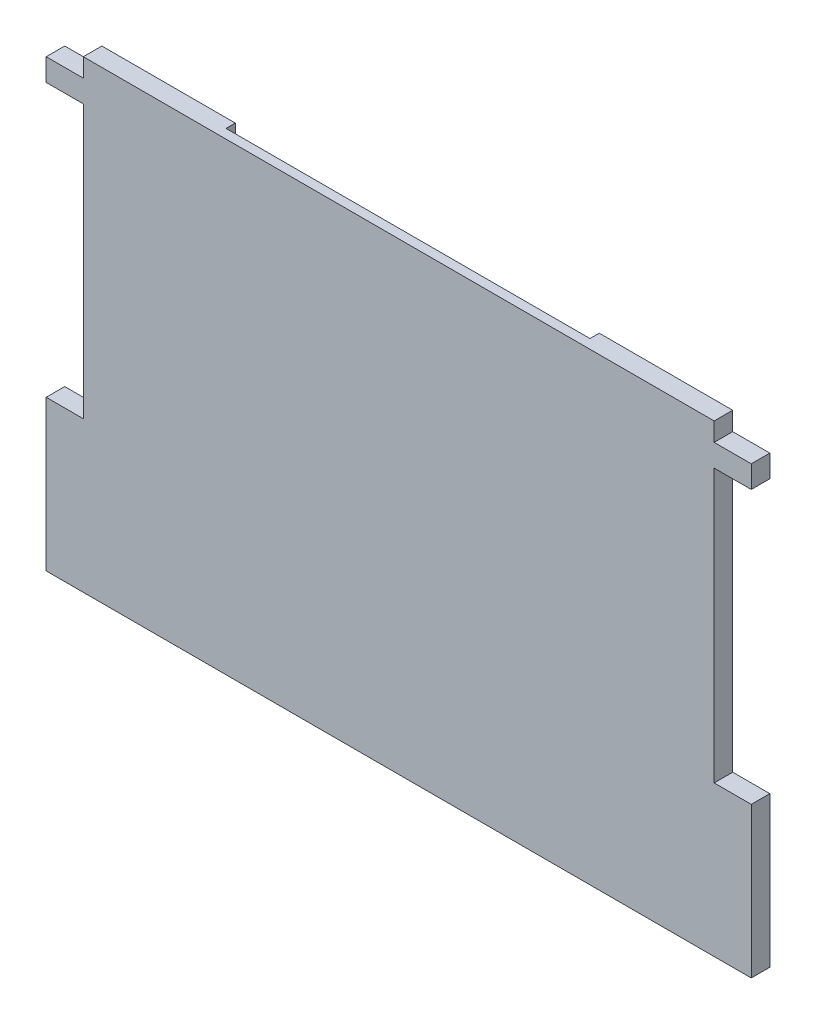
ISO-10303-21;
HEADER;
FILE_DESCRIPTION(('STEP AP214'),'2;1');
FILE_NAME('part.step','',(''),(''),'','','');
FILE_SCHEMA(('AUTOMOTIVE_DESIGN { 1 0 10303 214 1 1 1 1 }'));
ENDSEC;
DATA;
#1=APPLICATION_CONTEXT('core data for automotive mechanical design processes');
#2=APPLICATION_PROTOCOL_DEFINITION('international standard','automotive_design',2000,#1);
#3=PRODUCT_CONTEXT('',#1,'mechanical');
#4=PRODUCT('Part','Part','',(#3));
#5=PRODUCT_RELATED_PRODUCT_CATEGORY('part','',(#4));
#6=PRODUCT_DEFINITION_FORMATION('','',#4);
#7=PRODUCT_DEFINITION_CONTEXT('part definition',#1,'design');
#8=PRODUCT_DEFINITION('design','',#6,#7);
#9=PRODUCT_DEFINITION_SHAPE('','',#8);
#10=(LENGTH_UNIT() NAMED_UNIT(*) SI_UNIT(.MILLI.,.METRE.));
#11=(NAMED_UNIT(*) PLANE_ANGLE_UNIT() SI_UNIT($,.RADIAN.));
#12=(NAMED_UNIT(*) SI_UNIT($,.STERADIAN.) SOLID_ANGLE_UNIT());
#13=UNCERTAINTY_MEASURE_WITH_UNIT(LENGTH_MEASURE(1.E-05),#10,'distance_accuracy_value','');
#14=(GEOMETRIC_REPRESENTATION_CONTEXT(3) GLOBAL_UNCERTAINTY_ASSIGNED_CONTEXT((#13)) GLOBAL_UNIT_ASSIGNED_CONTEXT((#10,
#11,#12)) REPRESENTATION_CONTEXT('',''));
#15=CARTESIAN_POINT('',(0.,0.,0.));
#16=DIRECTION('',(0.,0.,1.));
#17=DIRECTION('',(1.,0.,0.));
#18=AXIS2_PLACEMENT_3D('',#15,#16,#17);
#19=CARTESIAN_POINT('',(-17.,-0.5,1.));
#20=DIRECTION('',(0.,-1.,0.));
#21=DIRECTION('',(0.,0.,-1.));
#22=AXIS2_PLACEMENT_3D('',#19,#20,#21);
#23=PLANE('',#22);
#24=DIRECTION('',(0.,0.,-1.));
#25=VECTOR('',#24,1.);
#26=CARTESIAN_POINT('',(9.80769230769232,-0.5,1.));
#27=LINE('',#26,#25);
#28=CARTESIAN_POINT('',(9.80769230769232,-0.5,0.5));
#29=VERTEX_POINT('',#28);
#30=CARTESIAN_POINT('',(9.80769230769232,-0.5,0.));
#31=VERTEX_POINT('',#30);
#32=EDGE_CURVE('E11',#29,#31,#27,.T.);
#33=ORIENTED_EDGE('',*,*,#32,.F.);
#34=DIRECTION('',(-1.,0.,0.));
#35=VECTOR('',#34,1.);
#36=CARTESIAN_POINT('',(-17.,-0.5,0.5));
#37=LINE('',#36,#35);
#38=CARTESIAN_POINT('',(-9.8076923076923,-0.5,0.5));
#39=VERTEX_POINT('',#38);
#40=EDGE_CURVE('E185',#29,#39,#37,.T.);
#41=ORIENTED_EDGE('',*,*,#40,.T.);
#42=DIRECTION('',(0.,0.,1.));
#43=VECTOR('',#42,1.);
#44=CARTESIAN_POINT('',(-9.8076923076923,-0.5,1.));
#45=LINE('',#44,#43);
#46=CARTESIAN_POINT('',(-9.8076923076923,-0.5,0.));
#47=VERTEX_POINT('',#46);
#48=EDGE_CURVE('E47',#47,#39,#45,.T.);
#49=ORIENTED_EDGE('',*,*,#48,.F.);
#50=DIRECTION('',(1.,0.,0.));
#51=VECTOR('',#50,1.);
#52=CARTESIAN_POINT('',(-17.,-0.5,0.));
#53=LINE('',#52,#51);
#54=CARTESIAN_POINT('',(-17.,-0.5,0.));
#55=VERTEX_POINT('',#54);
#56=EDGE_CURVE('E133',#47,#55,#53,.F.);
#57=ORIENTED_EDGE('',*,*,#56,.T.);
#58=DIRECTION('',(0.,0.,-1.));
#59=VECTOR('',#58,1.);
#60=CARTESIAN_POINT('',(-17.,-0.5,1.));
#61=LINE('',#60,#59);
#62=CARTESIAN_POINT('',(-17.,-0.5,1.));
#63=VERTEX_POINT('',#62);
#64=EDGE_CURVE('E127',#63,#55,#61,.T.);
#65=ORIENTED_EDGE('',*,*,#64,.F.);
#66=DIRECTION('',(-1.,0.,0.));
#67=VECTOR('',#66,1.);
#68=CARTESIAN_POINT('',(-17.,-0.5,1.));
#69=LINE('',#68,#67);
#70=CARTESIAN_POINT('',(17.,-0.5,1.));
#71=VERTEX_POINT('',#70);
#72=EDGE_CURVE('E170',#71,#63,#69,.T.);
#73=ORIENTED_EDGE('',*,*,#72,.F.);
#74=DIRECTION('',(0.,0.,-1.));
#75=VECTOR('',#74,1.);
#76=CARTESIAN_POINT('',(17.,-0.5,1.));
#77=LINE('',#76,#75);
#78=CARTESIAN_POINT('',(17.,-0.5,0.));
#79=VERTEX_POINT('',#78);
#80=EDGE_CURVE('E184',#71,#79,#77,.T.);
#81=ORIENTED_EDGE('',*,*,#80,.T.);
#82=DIRECTION('',(1.,0.,0.));
#83=VECTOR('',#82,1.);
#84=CARTESIAN_POINT('',(-17.,-0.5,0.));
#85=LINE('',#84,#83);
#86=EDGE_CURVE('E173',#79,#31,#85,.F.);
#87=ORIENTED_EDGE('',*,*,#86,.T.);
#88=EDGE_LOOP('',(#33,#41,#49,#57,#65,#73,#81,#87));
#89=FACE_BOUND('',#88,.T.);
#90=ADVANCED_FACE('F39',(#89),#23,.F.);
#91=CARTESIAN_POINT('',(0.,0.,0.));
#92=DIRECTION('',(0.,0.,-1.));
#93=DIRECTION('',(-1.,0.,0.));
#94=AXIS2_PLACEMENT_3D('',#91,#92,#93);
#95=PLANE('',#94);
#96=ORIENTED_EDGE('',*,*,#56,.F.);
#97=DIRECTION('',(0.,-1.,0.));
#98=VECTOR('',#97,1.);
#99=CARTESIAN_POINT('',(-9.8076923076923,1.53846153846154,0.));
#100=LINE('',#99,#98);
#101=CARTESIAN_POINT('',(-9.8076923076923,-1.92307692307692,0.));
#102=VERTEX_POINT('',#101);
#103=EDGE_CURVE('E174',#47,#102,#100,.T.);
#104=ORIENTED_EDGE('',*,*,#103,.T.);
#105=DIRECTION('',(1.,0.,0.));
#106=VECTOR('',#105,1.);
#107=CARTESIAN_POINT('',(-9.8076923076923,-1.92307692307692,0.));
#108=LINE('',#107,#106);
#109=CARTESIAN_POINT('',(-1.73076923076922,-1.92307692307692,0.));
#110=VERTEX_POINT('',#109);
#111=EDGE_CURVE('E180',#102,#110,#108,.T.);
#112=ORIENTED_EDGE('',*,*,#111,.T.);
#113=DIRECTION('',(0.,-1.,0.));
#114=VECTOR('',#113,1.);
#115=CARTESIAN_POINT('',(-1.73076923076922,-1.92307692307692,0.));
#116=LINE('',#115,#114);
#117=CARTESIAN_POINT('',(-1.73076923076922,-10.,0.));
#118=VERTEX_POINT('',#117);
#119=EDGE_CURVE('E288',#110,#118,#116,.T.);
#120=ORIENTED_EDGE('',*,*,#119,.T.);
#121=DIRECTION('',(1.,0.,0.));
#122=VECTOR('',#121,1.);
#123=CARTESIAN_POINT('',(-1.73076923076922,-10.,0.));
#124=LINE('',#123,#122);
#125=CARTESIAN_POINT('',(1.73076923076924,-10.,0.));
#126=VERTEX_POINT('',#125);
#127=EDGE_CURVE('E59',#118,#126,#124,.T.);
#128=ORIENTED_EDGE('',*,*,#127,.T.);
#129=DIRECTION('',(0.,1.,0.));
#130=VECTOR('',#129,1.);
#131=CARTESIAN_POINT('',(1.73076923076924,-10.,0.));
#132=LINE('',#131,#130);
#133=CARTESIAN_POINT('',(1.73076923076924,-1.92307692307692,0.));
#134=VERTEX_POINT('',#133);
#135=EDGE_CURVE('E300',#126,#134,#132,.T.);
#136=ORIENTED_EDGE('',*,*,#135,.T.);
#137=DIRECTION('',(1.,0.,0.));
#138=VECTOR('',#137,1.);
#139=CARTESIAN_POINT('',(1.73076923076924,-1.92307692307692,0.));
#140=LINE('',#139,#138);
#141=CARTESIAN_POINT('',(9.80769230769232,-1.92307692307692,0.));
#142=VERTEX_POINT('',#141);
#143=EDGE_CURVE('E178',#134,#142,#140,.T.);
#144=ORIENTED_EDGE('',*,*,#143,.T.);
#145=DIRECTION('',(0.,1.,0.));
#146=VECTOR('',#145,1.);
#147=CARTESIAN_POINT('',(9.80769230769232,-1.92307692307692,0.));
#148=LINE('',#147,#146);
#149=EDGE_CURVE('E172',#142,#31,#148,.T.);
#150=ORIENTED_EDGE('',*,*,#149,.T.);
#151=ORIENTED_EDGE('',*,*,#86,.F.);
#152=DIRECTION('',(0.,1.,0.));
#153=VECTOR('',#152,1.);
#154=CARTESIAN_POINT('',(17.,-0.5,0.));
#155=LINE('',#154,#153);
#156=CARTESIAN_POINT('',(17.,-1.5,0.));
#157=VERTEX_POINT('',#156);
#158=EDGE_CURVE('E167',#157,#79,#155,.T.);
#159=ORIENTED_EDGE('',*,*,#158,.F.);
#160=DIRECTION('',(1.,0.,0.));
#161=VECTOR('',#160,1.);
#162=CARTESIAN_POINT('',(17.,-1.5,0.));
#163=LINE('',#162,#161);
#164=CARTESIAN_POINT('',(19.,-1.5,0.));
#165=VERTEX_POINT('',#164);
#166=EDGE_CURVE('E163',#165,#157,#163,.F.);
#167=ORIENTED_EDGE('',*,*,#166,.F.);
#168=DIRECTION('',(0.,1.,0.));
#169=VECTOR('',#168,1.);
#170=CARTESIAN_POINT('',(19.,-1.5,0.));
#171=LINE('',#170,#169);
#172=CARTESIAN_POINT('',(19.,-2.7,0.));
#173=VERTEX_POINT('',#172);
#174=EDGE_CURVE('E165',#173,#165,#171,.T.);
#175=ORIENTED_EDGE('',*,*,#174,.F.);
#176=DIRECTION('',(1.,0.,0.));
#177=VECTOR('',#176,1.);
#178=CARTESIAN_POINT('',(19.,-2.7,0.));
#179=LINE('',#178,#177);
#180=CARTESIAN_POINT('',(17.,-2.7,0.));
#181=VERTEX_POINT('',#180);
#182=EDGE_CURVE('E162',#181,#173,#179,.T.);
#183=ORIENTED_EDGE('',*,*,#182,.F.);
#184=DIRECTION('',(0.,1.,0.));
#185=VECTOR('',#184,1.);
#186=CARTESIAN_POINT('',(17.,-2.7,0.));
#187=LINE('',#186,#185);
#188=CARTESIAN_POINT('',(17.,-17.3947217067352,0.));
#189=VERTEX_POINT('',#188);
#190=EDGE_CURVE('E159',#189,#181,#187,.T.);
#191=ORIENTED_EDGE('',*,*,#190,.F.);
#192=DIRECTION('',(1.,0.,0.));
#193=VECTOR('',#192,1.);
#194=CARTESIAN_POINT('',(17.,-17.3947217067352,0.));
#195=LINE('',#194,#193);
#196=CARTESIAN_POINT('',(19.,-17.3947217067352,0.));
#197=VERTEX_POINT('',#196);
#198=EDGE_CURVE('E160',#197,#189,#195,.F.);
#199=ORIENTED_EDGE('',*,*,#198,.F.);
#200=DIRECTION('',(0.,1.,0.));
#201=VECTOR('',#200,1.);
#202=CARTESIAN_POINT('',(19.,-17.3947217067352,0.));
#203=LINE('',#202,#201);
#204=CARTESIAN_POINT('',(19.,-25.5,0.));
#205=VERTEX_POINT('',#204);
#206=EDGE_CURVE('E153',#205,#197,#203,.T.);
#207=ORIENTED_EDGE('',*,*,#206,.F.);
#208=DIRECTION('',(1.,0.,0.));
#209=VECTOR('',#208,1.);
#210=CARTESIAN_POINT('',(19.,-25.5,0.));
#211=LINE('',#210,#209);
#212=CARTESIAN_POINT('',(-19.,-25.5,0.));
#213=VERTEX_POINT('',#212);
#214=EDGE_CURVE('E155',#213,#205,#211,.T.);
#215=ORIENTED_EDGE('',*,*,#214,.F.);
#216=DIRECTION('',(0.,1.,0.));
#217=VECTOR('',#216,1.);
#218=CARTESIAN_POINT('',(-19.,-25.5,0.));
#219=LINE('',#218,#217);
#220=CARTESIAN_POINT('',(-19.,-17.3947217067352,0.));
#221=VERTEX_POINT('',#220);
#222=EDGE_CURVE('E152',#221,#213,#219,.F.);
#223=ORIENTED_EDGE('',*,*,#222,.F.);
#224=DIRECTION('',(1.,0.,0.));
#225=VECTOR('',#224,1.);
#226=CARTESIAN_POINT('',(-19.,-17.3947217067352,0.));
#227=LINE('',#226,#225);
#228=CARTESIAN_POINT('',(-17.,-17.3947217067352,0.));
#229=VERTEX_POINT('',#228);
#230=EDGE_CURVE('E146',#229,#221,#227,.F.);
#231=ORIENTED_EDGE('',*,*,#230,.F.);
#232=DIRECTION('',(0.,1.,0.));
#233=VECTOR('',#232,1.);
#234=CARTESIAN_POINT('',(-17.,-17.3947217067352,0.));
#235=LINE('',#234,#233);
#236=CARTESIAN_POINT('',(-17.,-2.7,0.));
#237=VERTEX_POINT('',#236);
#238=EDGE_CURVE('E150',#237,#229,#235,.F.);
#239=ORIENTED_EDGE('',*,*,#238,.F.);
#240=DIRECTION('',(1.,0.,0.));
#241=VECTOR('',#240,1.);
#242=CARTESIAN_POINT('',(-17.,-2.7,0.));
#243=LINE('',#242,#241);
#244=CARTESIAN_POINT('',(-19.,-2.7,0.));
#245=VERTEX_POINT('',#244);
#246=EDGE_CURVE('E142',#245,#237,#243,.T.);
#247=ORIENTED_EDGE('',*,*,#246,.F.);
#248=DIRECTION('',(0.,1.,0.));
#249=VECTOR('',#248,1.);
#250=CARTESIAN_POINT('',(-19.,-2.7,0.));
#251=LINE('',#250,#249);
#252=CARTESIAN_POINT('',(-19.,-1.5,0.));
#253=VERTEX_POINT('',#252);
#254=EDGE_CURVE('E145',#253,#245,#251,.F.);
#255=ORIENTED_EDGE('',*,*,#254,.F.);
#256=DIRECTION('',(1.,0.,0.));
#257=VECTOR('',#256,1.);
#258=CARTESIAN_POINT('',(-19.,-1.5,0.));
#259=LINE('',#258,#257);
#260=CARTESIAN_POINT('',(-17.,-1.5,0.));
#261=VERTEX_POINT('',#260);
#262=EDGE_CURVE('E119',#261,#253,#259,.F.);
#263=ORIENTED_EDGE('',*,*,#262,.F.);
#264=DIRECTION('',(0.,1.,0.));
#265=VECTOR('',#264,1.);
#266=CARTESIAN_POINT('',(-17.,-1.5,0.));
#267=LINE('',#266,#265);
#268=EDGE_CURVE('E43',#55,#261,#267,.F.);
#269=ORIENTED_EDGE('',*,*,#268,.F.);
#270=EDGE_LOOP('',(#96,#104,#112,#120,#128,#136,#144,#150,#151,#159,#167,#175,#183,#191,#199,
#207,#215,#223,#231,#239,#247,#255,#263,#269));
#271=FACE_BOUND('',#270,.T.);
#272=ADVANCED_FACE('F139',(#271),#95,.T.);
#273=CARTESIAN_POINT('',(-17.,-1.5,1.));
#274=DIRECTION('',(1.,0.,0.));
#275=DIRECTION('',(0.,0.,-1.));
#276=AXIS2_PLACEMENT_3D('',#273,#274,#275);
#277=PLANE('',#276);
#278=ORIENTED_EDGE('',*,*,#268,.T.);
#279=DIRECTION('',(0.,0.,-1.));
#280=VECTOR('',#279,1.);
#281=CARTESIAN_POINT('',(-17.,-1.5,1.));
#282=LINE('',#281,#280);
#283=CARTESIAN_POINT('',(-17.,-1.5,1.));
#284=VERTEX_POINT('',#283);
#285=EDGE_CURVE('E130',#284,#261,#282,.T.);
#286=ORIENTED_EDGE('',*,*,#285,.F.);
#287=DIRECTION('',(0.,-1.,0.));
#288=VECTOR('',#287,1.);
#289=CARTESIAN_POINT('',(-17.,-1.5,1.));
#290=LINE('',#289,#288);
#291=EDGE_CURVE('E235',#63,#284,#290,.T.);
#292=ORIENTED_EDGE('',*,*,#291,.F.);
#293=ORIENTED_EDGE('',*,*,#64,.T.);
#294=EDGE_LOOP('',(#278,#286,#292,#293));
#295=FACE_BOUND('',#294,.T.);
#296=ADVANCED_FACE('F125',(#295),#277,.F.);
#297=CARTESIAN_POINT('',(-19.,-1.5,1.));
#298=DIRECTION('',(0.,-1.,0.));
#299=DIRECTION('',(1.,0.,0.));
#300=AXIS2_PLACEMENT_3D('',#297,#298,#299);
#301=PLANE('',#300);
#302=ORIENTED_EDGE('',*,*,#262,.T.);
#303=DIRECTION('',(0.,0.,-1.));
#304=VECTOR('',#303,1.);
#305=CARTESIAN_POINT('',(-19.,-1.5,1.));
#306=LINE('',#305,#304);
#307=CARTESIAN_POINT('',(-19.,-1.5,1.));
#308=VERTEX_POINT('',#307);
#309=EDGE_CURVE('E140',#308,#253,#306,.T.);
#310=ORIENTED_EDGE('',*,*,#309,.F.);
#311=DIRECTION('',(-1.,0.,0.));
#312=VECTOR('',#311,1.);
#313=CARTESIAN_POINT('',(-19.,-1.5,1.));
#314=LINE('',#313,#312);
#315=EDGE_CURVE('E136',#284,#308,#314,.T.);
#316=ORIENTED_EDGE('',*,*,#315,.F.);
#317=ORIENTED_EDGE('',*,*,#285,.T.);
#318=EDGE_LOOP('',(#302,#310,#316,#317));
#319=FACE_BOUND('',#318,.T.);
#320=ADVANCED_FACE('F132',(#319),#301,.F.);
#321=CARTESIAN_POINT('',(-19.,-2.7,1.));
#322=DIRECTION('',(1.,0.,0.));
#323=DIRECTION('',(0.,0.,-1.));
#324=AXIS2_PLACEMENT_3D('',#321,#322,#323);
#325=PLANE('',#324);
#326=ORIENTED_EDGE('',*,*,#254,.T.);
#327=DIRECTION('',(0.,0.,-1.));
#328=VECTOR('',#327,1.);
#329=CARTESIAN_POINT('',(-19.,-2.7,1.));
#330=LINE('',#329,#328);
#331=CARTESIAN_POINT('',(-19.,-2.7,1.));
#332=VERTEX_POINT('',#331);
#333=EDGE_CURVE('E225',#332,#245,#330,.T.);
#334=ORIENTED_EDGE('',*,*,#333,.F.);
#335=DIRECTION('',(0.,-1.,0.));
#336=VECTOR('',#335,1.);
#337=CARTESIAN_POINT('',(-19.,-2.7,1.));
#338=LINE('',#337,#336);
#339=EDGE_CURVE('E237',#308,#332,#338,.T.);
#340=ORIENTED_EDGE('',*,*,#339,.F.);
#341=ORIENTED_EDGE('',*,*,#309,.T.);
#342=EDGE_LOOP('',(#326,#334,#340,#341));
#343=FACE_BOUND('',#342,.T.);
#344=ADVANCED_FACE('F471',(#343),#325,.F.);
#345=CARTESIAN_POINT('',(-17.,-2.7,1.));
#346=DIRECTION('',(0.,1.,0.));
#347=DIRECTION('',(0.,0.,1.));
#348=AXIS2_PLACEMENT_3D('',#345,#346,#347);
#349=PLANE('',#348);
#350=ORIENTED_EDGE('',*,*,#246,.T.);
#351=DIRECTION('',(0.,0.,-1.));
#352=VECTOR('',#351,1.);
#353=CARTESIAN_POINT('',(-17.,-2.7,1.));
#354=LINE('',#353,#352);
#355=CARTESIAN_POINT('',(-17.,-2.7,1.));
#356=VERTEX_POINT('',#355);
#357=EDGE_CURVE('E219',#356,#237,#354,.T.);
#358=ORIENTED_EDGE('',*,*,#357,.F.);
#359=DIRECTION('',(1.,0.,0.));
#360=VECTOR('',#359,1.);
#361=CARTESIAN_POINT('',(-17.,-2.7,1.));
#362=LINE('',#361,#360);
#363=EDGE_CURVE('E236',#332,#356,#362,.T.);
#364=ORIENTED_EDGE('',*,*,#363,.F.);
#365=ORIENTED_EDGE('',*,*,#333,.T.);
#366=EDGE_LOOP('',(#350,#358,#364,#365));
#367=FACE_BOUND('',#366,.T.);
#368=ADVANCED_FACE('F466',(#367),#349,.F.);
#369=CARTESIAN_POINT('',(-17.,-17.3947217067352,1.));
#370=DIRECTION('',(1.,0.,0.));
#371=DIRECTION('',(0.,0.,-1.));
#372=AXIS2_PLACEMENT_3D('',#369,#370,#371);
#373=PLANE('',#372);
#374=ORIENTED_EDGE('',*,*,#238,.T.);
#375=DIRECTION('',(0.,0.,-1.));
#376=VECTOR('',#375,1.);
#377=CARTESIAN_POINT('',(-17.,-17.3947217067352,1.));
#378=LINE('',#377,#376);
#379=CARTESIAN_POINT('',(-17.,-17.3947217067352,1.));
#380=VERTEX_POINT('',#379);
#381=EDGE_CURVE('E218',#380,#229,#378,.T.);
#382=ORIENTED_EDGE('',*,*,#381,.F.);
#383=DIRECTION('',(0.,-1.,0.));
#384=VECTOR('',#383,1.);
#385=CARTESIAN_POINT('',(-17.,-17.3947217067352,1.));
#386=LINE('',#385,#384);
#387=EDGE_CURVE('E244',#356,#380,#386,.T.);
#388=ORIENTED_EDGE('',*,*,#387,.F.);
#389=ORIENTED_EDGE('',*,*,#357,.T.);
#390=EDGE_LOOP('',(#374,#382,#388,#389));
#391=FACE_BOUND('',#390,.T.);
#392=ADVANCED_FACE('F463',(#391),#373,.F.);
#393=CARTESIAN_POINT('',(-19.,-17.3947217067352,1.));
#394=DIRECTION('',(0.,-1.,0.));
#395=DIRECTION('',(0.,0.,-1.));
#396=AXIS2_PLACEMENT_3D('',#393,#394,#395);
#397=PLANE('',#396);
#398=ORIENTED_EDGE('',*,*,#230,.T.);
#399=DIRECTION('',(0.,0.,-1.));
#400=VECTOR('',#399,1.);
#401=CARTESIAN_POINT('',(-19.,-17.3947217067352,1.));
#402=LINE('',#401,#400);
#403=CARTESIAN_POINT('',(-19.,-17.3947217067352,1.));
#404=VERTEX_POINT('',#403);
#405=EDGE_CURVE('E211',#404,#221,#402,.T.);
#406=ORIENTED_EDGE('',*,*,#405,.F.);
#407=DIRECTION('',(-1.,0.,0.));
#408=VECTOR('',#407,1.);
#409=CARTESIAN_POINT('',(-19.,-17.3947217067352,1.));
#410=LINE('',#409,#408);
#411=EDGE_CURVE('E243',#380,#404,#410,.T.);
#412=ORIENTED_EDGE('',*,*,#411,.F.);
#413=ORIENTED_EDGE('',*,*,#381,.T.);
#414=EDGE_LOOP('',(#398,#406,#412,#413));
#415=FACE_BOUND('',#414,.T.);
#416=ADVANCED_FACE('F459',(#415),#397,.F.);
#417=CARTESIAN_POINT('',(-19.,-25.5,1.));
#418=DIRECTION('',(1.,0.,0.));
#419=DIRECTION('',(0.,0.,-1.));
#420=AXIS2_PLACEMENT_3D('',#417,#418,#419);
#421=PLANE('',#420);
#422=ORIENTED_EDGE('',*,*,#222,.T.);
#423=DIRECTION('',(0.,0.,-1.));
#424=VECTOR('',#423,1.);
#425=CARTESIAN_POINT('',(-19.,-25.5,1.));
#426=LINE('',#425,#424);
#427=CARTESIAN_POINT('',(-19.,-25.5,1.));
#428=VERTEX_POINT('',#427);
#429=EDGE_CURVE('E208',#428,#213,#426,.T.);
#430=ORIENTED_EDGE('',*,*,#429,.F.);
#431=DIRECTION('',(0.,-1.,0.));
#432=VECTOR('',#431,1.);
#433=CARTESIAN_POINT('',(-19.,-25.5,1.));
#434=LINE('',#433,#432);
#435=EDGE_CURVE('E246',#404,#428,#434,.T.);
#436=ORIENTED_EDGE('',*,*,#435,.F.);
#437=ORIENTED_EDGE('',*,*,#405,.T.);
#438=EDGE_LOOP('',(#422,#430,#436,#437));
#439=FACE_BOUND('',#438,.T.);
#440=ADVANCED_FACE('F454',(#439),#421,.F.);
#441=CARTESIAN_POINT('',(19.,-25.5,1.));
#442=DIRECTION('',(0.,1.,0.));
#443=DIRECTION('',(0.,0.,1.));
#444=AXIS2_PLACEMENT_3D('',#441,#442,#443);
#445=PLANE('',#444);
#446=ORIENTED_EDGE('',*,*,#214,.T.);
#447=DIRECTION('',(0.,0.,-1.));
#448=VECTOR('',#447,1.);
#449=CARTESIAN_POINT('',(19.,-25.5,1.));
#450=LINE('',#449,#448);
#451=CARTESIAN_POINT('',(19.,-25.5,1.));
#452=VERTEX_POINT('',#451);
#453=EDGE_CURVE('E209',#452,#205,#450,.T.);
#454=ORIENTED_EDGE('',*,*,#453,.F.);
#455=DIRECTION('',(1.,0.,0.));
#456=VECTOR('',#455,1.);
#457=CARTESIAN_POINT('',(19.,-25.5,1.));
#458=LINE('',#457,#456);
#459=EDGE_CURVE('E252',#428,#452,#458,.T.);
#460=ORIENTED_EDGE('',*,*,#459,.F.);
#461=ORIENTED_EDGE('',*,*,#429,.T.);
#462=EDGE_LOOP('',(#446,#454,#460,#461));
#463=FACE_BOUND('',#462,.T.);
#464=ADVANCED_FACE('F451',(#463),#445,.F.);
#465=CARTESIAN_POINT('',(19.,-17.3947217067352,1.));
#466=DIRECTION('',(-1.,0.,0.));
#467=DIRECTION('',(0.,0.,1.));
#468=AXIS2_PLACEMENT_3D('',#465,#466,#467);
#469=PLANE('',#468);
#470=ORIENTED_EDGE('',*,*,#206,.T.);
#471=DIRECTION('',(0.,0.,-1.));
#472=VECTOR('',#471,1.);
#473=CARTESIAN_POINT('',(19.,-17.3947217067352,1.));
#474=LINE('',#473,#472);
#475=CARTESIAN_POINT('',(19.,-17.3947217067352,1.));
#476=VERTEX_POINT('',#475);
#477=EDGE_CURVE('E204',#476,#197,#474,.T.);
#478=ORIENTED_EDGE('',*,*,#477,.F.);
#479=DIRECTION('',(0.,1.,0.));
#480=VECTOR('',#479,1.);
#481=CARTESIAN_POINT('',(19.,-17.3947217067352,1.));
#482=LINE('',#481,#480);
#483=EDGE_CURVE('E251',#452,#476,#482,.T.);
#484=ORIENTED_EDGE('',*,*,#483,.F.);
#485=ORIENTED_EDGE('',*,*,#453,.T.);
#486=EDGE_LOOP('',(#470,#478,#484,#485));
#487=FACE_BOUND('',#486,.T.);
#488=ADVANCED_FACE('F446',(#487),#469,.F.);
#489=CARTESIAN_POINT('',(17.,-17.3947217067352,1.));
#490=DIRECTION('',(0.,-1.,0.));
#491=DIRECTION('',(0.,0.,-1.));
#492=AXIS2_PLACEMENT_3D('',#489,#490,#491);
#493=PLANE('',#492);
#494=ORIENTED_EDGE('',*,*,#198,.T.);
#495=DIRECTION('',(0.,0.,-1.));
#496=VECTOR('',#495,1.);
#497=CARTESIAN_POINT('',(17.,-17.3947217067352,1.));
#498=LINE('',#497,#496);
#499=CARTESIAN_POINT('',(17.,-17.3947217067352,1.));
#500=VERTEX_POINT('',#499);
#501=EDGE_CURVE('E202',#500,#189,#498,.T.);
#502=ORIENTED_EDGE('',*,*,#501,.F.);
#503=DIRECTION('',(-1.,0.,0.));
#504=VECTOR('',#503,1.);
#505=CARTESIAN_POINT('',(17.,-17.3947217067352,1.));
#506=LINE('',#505,#504);
#507=EDGE_CURVE('E257',#476,#500,#506,.T.);
#508=ORIENTED_EDGE('',*,*,#507,.F.);
#509=ORIENTED_EDGE('',*,*,#477,.T.);
#510=EDGE_LOOP('',(#494,#502,#508,#509));
#511=FACE_BOUND('',#510,.T.);
#512=ADVANCED_FACE('F439',(#511),#493,.F.);
#513=CARTESIAN_POINT('',(17.,-2.7,1.));
#514=DIRECTION('',(-1.,0.,0.));
#515=DIRECTION('',(0.,0.,1.));
#516=AXIS2_PLACEMENT_3D('',#513,#514,#515);
#517=PLANE('',#516);
#518=ORIENTED_EDGE('',*,*,#190,.T.);
#519=DIRECTION('',(0.,0.,-1.));
#520=VECTOR('',#519,1.);
#521=CARTESIAN_POINT('',(17.,-2.7,1.));
#522=LINE('',#521,#520);
#523=CARTESIAN_POINT('',(17.,-2.7,1.));
#524=VERTEX_POINT('',#523);
#525=EDGE_CURVE('E200',#524,#181,#522,.T.);
#526=ORIENTED_EDGE('',*,*,#525,.F.);
#527=DIRECTION('',(0.,1.,0.));
#528=VECTOR('',#527,1.);
#529=CARTESIAN_POINT('',(17.,-2.7,1.));
#530=LINE('',#529,#528);
#531=EDGE_CURVE('E259',#500,#524,#530,.T.);
#532=ORIENTED_EDGE('',*,*,#531,.F.);
#533=ORIENTED_EDGE('',*,*,#501,.T.);
#534=EDGE_LOOP('',(#518,#526,#532,#533));
#535=FACE_BOUND('',#534,.T.);
#536=ADVANCED_FACE('F438',(#535),#517,.F.);
#537=CARTESIAN_POINT('',(19.,-2.7,1.));
#538=DIRECTION('',(0.,1.,0.));
#539=DIRECTION('',(0.,0.,1.));
#540=AXIS2_PLACEMENT_3D('',#537,#538,#539);
#541=PLANE('',#540);
#542=ORIENTED_EDGE('',*,*,#182,.T.);
#543=DIRECTION('',(0.,0.,-1.));
#544=VECTOR('',#543,1.);
#545=CARTESIAN_POINT('',(19.,-2.7,1.));
#546=LINE('',#545,#544);
#547=CARTESIAN_POINT('',(19.,-2.7,1.));
#548=VERTEX_POINT('',#547);
#549=EDGE_CURVE('E193',#548,#173,#546,.T.);
#550=ORIENTED_EDGE('',*,*,#549,.F.);
#551=DIRECTION('',(1.,0.,0.));
#552=VECTOR('',#551,1.);
#553=CARTESIAN_POINT('',(19.,-2.7,1.));
#554=LINE('',#553,#552);
#555=EDGE_CURVE('E261',#524,#548,#554,.T.);
#556=ORIENTED_EDGE('',*,*,#555,.F.);
#557=ORIENTED_EDGE('',*,*,#525,.T.);
#558=EDGE_LOOP('',(#542,#550,#556,#557));
#559=FACE_BOUND('',#558,.T.);
#560=ADVANCED_FACE('F432',(#559),#541,.F.);
#561=CARTESIAN_POINT('',(19.,-1.5,1.));
#562=DIRECTION('',(-1.,0.,0.));
#563=DIRECTION('',(0.,0.,1.));
#564=AXIS2_PLACEMENT_3D('',#561,#562,#563);
#565=PLANE('',#564);
#566=ORIENTED_EDGE('',*,*,#174,.T.);
#567=DIRECTION('',(0.,0.,-1.));
#568=VECTOR('',#567,1.);
#569=CARTESIAN_POINT('',(19.,-1.5,1.));
#570=LINE('',#569,#568);
#571=CARTESIAN_POINT('',(19.,-1.5,1.));
#572=VERTEX_POINT('',#571);
#573=EDGE_CURVE('E195',#572,#165,#570,.T.);
#574=ORIENTED_EDGE('',*,*,#573,.F.);
#575=DIRECTION('',(0.,1.,0.));
#576=VECTOR('',#575,1.);
#577=CARTESIAN_POINT('',(19.,-1.5,1.));
#578=LINE('',#577,#576);
#579=EDGE_CURVE('E266',#548,#572,#578,.T.);
#580=ORIENTED_EDGE('',*,*,#579,.F.);
#581=ORIENTED_EDGE('',*,*,#549,.T.);
#582=EDGE_LOOP('',(#566,#574,#580,#581));
#583=FACE_BOUND('',#582,.T.);
#584=ADVANCED_FACE('F423',(#583),#565,.F.);
#585=CARTESIAN_POINT('',(17.,-1.5,1.));
#586=DIRECTION('',(0.,-1.,0.));
#587=DIRECTION('',(1.,0.,0.));
#588=AXIS2_PLACEMENT_3D('',#585,#586,#587);
#589=PLANE('',#588);
#590=ORIENTED_EDGE('',*,*,#166,.T.);
#591=DIRECTION('',(0.,0.,-1.));
#592=VECTOR('',#591,1.);
#593=CARTESIAN_POINT('',(17.,-1.5,1.));
#594=LINE('',#593,#592);
#595=CARTESIAN_POINT('',(17.,-1.5,1.));
#596=VERTEX_POINT('',#595);
#597=EDGE_CURVE('E188',#596,#157,#594,.T.);
#598=ORIENTED_EDGE('',*,*,#597,.F.);
#599=DIRECTION('',(-1.,0.,0.));
#600=VECTOR('',#599,1.);
#601=CARTESIAN_POINT('',(17.,-1.5,1.));
#602=LINE('',#601,#600);
#603=EDGE_CURVE('E267',#572,#596,#602,.T.);
#604=ORIENTED_EDGE('',*,*,#603,.F.);
#605=ORIENTED_EDGE('',*,*,#573,.T.);
#606=EDGE_LOOP('',(#590,#598,#604,#605));
#607=FACE_BOUND('',#606,.T.);
#608=ADVANCED_FACE('F422',(#607),#589,.F.);
#609=CARTESIAN_POINT('',(17.,-0.5,1.));
#610=DIRECTION('',(-1.,0.,0.));
#611=DIRECTION('',(0.,0.,1.));
#612=AXIS2_PLACEMENT_3D('',#609,#610,#611);
#613=PLANE('',#612);
#614=ORIENTED_EDGE('',*,*,#158,.T.);
#615=ORIENTED_EDGE('',*,*,#80,.F.);
#616=DIRECTION('',(0.,1.,0.));
#617=VECTOR('',#616,1.);
#618=CARTESIAN_POINT('',(17.,-0.5,1.));
#619=LINE('',#618,#617);
#620=EDGE_CURVE('E187',#596,#71,#619,.T.);
#621=ORIENTED_EDGE('',*,*,#620,.F.);
#622=ORIENTED_EDGE('',*,*,#597,.T.);
#623=EDGE_LOOP('',(#614,#615,#621,#622));
#624=FACE_BOUND('',#623,.T.);
#625=ADVANCED_FACE('F420',(#624),#613,.F.);
#626=CARTESIAN_POINT('',(0.,0.,1.));
#627=DIRECTION('',(0.,0.,-1.));
#628=DIRECTION('',(-1.,0.,0.));
#629=AXIS2_PLACEMENT_3D('',#626,#627,#628);
#630=PLANE('',#629);
#631=ORIENTED_EDGE('',*,*,#72,.T.);
#632=ORIENTED_EDGE('',*,*,#291,.T.);
#633=ORIENTED_EDGE('',*,*,#315,.T.);
#634=ORIENTED_EDGE('',*,*,#339,.T.);
#635=ORIENTED_EDGE('',*,*,#363,.T.);
#636=ORIENTED_EDGE('',*,*,#387,.T.);
#637=ORIENTED_EDGE('',*,*,#411,.T.);
#638=ORIENTED_EDGE('',*,*,#435,.T.);
#639=ORIENTED_EDGE('',*,*,#459,.T.);
#640=ORIENTED_EDGE('',*,*,#483,.T.);
#641=ORIENTED_EDGE('',*,*,#507,.T.);
#642=ORIENTED_EDGE('',*,*,#531,.T.);
#643=ORIENTED_EDGE('',*,*,#555,.T.);
#644=ORIENTED_EDGE('',*,*,#579,.T.);
#645=ORIENTED_EDGE('',*,*,#603,.T.);
#646=ORIENTED_EDGE('',*,*,#620,.T.);
#647=EDGE_LOOP('',(#631,#632,#633,#634,#635,#636,#637,#638,#639,#640,#641,#642,#643,#644,#645,#646));
#648=FACE_BOUND('',#647,.T.);
#649=ADVANCED_FACE('F41',(#648),#630,.F.);
#650=CARTESIAN_POINT('',(9.80769230769232,-1.92307692307692,0.5));
#651=DIRECTION('',(-1.,0.,0.));
#652=DIRECTION('',(0.,0.,1.));
#653=AXIS2_PLACEMENT_3D('',#650,#651,#652);
#654=PLANE('',#653);
#655=ORIENTED_EDGE('',*,*,#32,.T.);
#656=ORIENTED_EDGE('',*,*,#149,.F.);
#657=DIRECTION('',(0.,0.,-1.));
#658=VECTOR('',#657,1.);
#659=CARTESIAN_POINT('',(9.80769230769232,-1.92307692307692,0.5));
#660=LINE('',#659,#658);
#661=CARTESIAN_POINT('',(9.80769230769232,-1.92307692307692,0.5));
#662=VERTEX_POINT('',#661);
#663=EDGE_CURVE('E277',#662,#142,#660,.T.);
#664=ORIENTED_EDGE('',*,*,#663,.F.);
#665=DIRECTION('',(0.,1.,0.));
#666=VECTOR('',#665,1.);
#667=CARTESIAN_POINT('',(9.80769230769232,-1.92307692307692,0.5));
#668=LINE('',#667,#666);
#669=EDGE_CURVE('E307',#662,#29,#668,.T.);
#670=ORIENTED_EDGE('',*,*,#669,.T.);
#671=EDGE_LOOP('',(#655,#656,#664,#670));
#672=FACE_BOUND('',#671,.T.);
#673=ADVANCED_FACE('F411',(#672),#654,.T.);
#674=CARTESIAN_POINT('',(-9.8076923076923,1.53846153846154,0.5));
#675=DIRECTION('',(1.,0.,0.));
#676=DIRECTION('',(0.,0.,-1.));
#677=AXIS2_PLACEMENT_3D('',#674,#675,#676);
#678=PLANE('',#677);
#679=ORIENTED_EDGE('',*,*,#48,.T.);
#680=DIRECTION('',(0.,-1.,0.));
#681=VECTOR('',#680,1.);
#682=CARTESIAN_POINT('',(-9.8076923076923,1.53846153846154,0.5));
#683=LINE('',#682,#681);
#684=CARTESIAN_POINT('',(-9.8076923076923,-1.92307692307692,0.5));
#685=VERTEX_POINT('',#684);
#686=EDGE_CURVE('E310',#39,#685,#683,.T.);
#687=ORIENTED_EDGE('',*,*,#686,.T.);
#688=DIRECTION('',(0.,0.,-1.));
#689=VECTOR('',#688,1.);
#690=CARTESIAN_POINT('',(-9.8076923076923,-1.92307692307692,0.5));
#691=LINE('',#690,#689);
#692=EDGE_CURVE('E282',#685,#102,#691,.T.);
#693=ORIENTED_EDGE('',*,*,#692,.T.);
#694=ORIENTED_EDGE('',*,*,#103,.F.);
#695=EDGE_LOOP('',(#679,#687,#693,#694));
#696=FACE_BOUND('',#695,.T.);
#697=ADVANCED_FACE('F387',(#696),#678,.T.);
#698=CARTESIAN_POINT('',(0.,0.,0.5));
#699=DIRECTION('',(0.,0.,1.));
#700=DIRECTION('',(1.,0.,0.));
#701=AXIS2_PLACEMENT_3D('',#698,#699,#700);
#702=PLANE('',#701);
#703=ORIENTED_EDGE('',*,*,#669,.F.);
#704=DIRECTION('',(1.,0.,0.));
#705=VECTOR('',#704,1.);
#706=CARTESIAN_POINT('',(1.73076923076924,-1.92307692307692,0.5));
#707=LINE('',#706,#705);
#708=CARTESIAN_POINT('',(1.73076923076924,-1.92307692307692,0.5));
#709=VERTEX_POINT('',#708);
#710=EDGE_CURVE('E313',#709,#662,#707,.T.);
#711=ORIENTED_EDGE('',*,*,#710,.F.);
#712=DIRECTION('',(0.,1.,0.));
#713=VECTOR('',#712,1.);
#714=CARTESIAN_POINT('',(1.73076923076924,-10.,0.5));
#715=LINE('',#714,#713);
#716=CARTESIAN_POINT('',(1.73076923076924,-10.,0.5));
#717=VERTEX_POINT('',#716);
#718=EDGE_CURVE('E316',#717,#709,#715,.T.);
#719=ORIENTED_EDGE('',*,*,#718,.F.);
#720=DIRECTION('',(1.,0.,0.));
#721=VECTOR('',#720,1.);
#722=CARTESIAN_POINT('',(-1.73076923076922,-10.,0.5));
#723=LINE('',#722,#721);
#724=CARTESIAN_POINT('',(-1.73076923076922,-10.,0.5));
#725=VERTEX_POINT('',#724);
#726=EDGE_CURVE('E291',#725,#717,#723,.T.);
#727=ORIENTED_EDGE('',*,*,#726,.F.);
#728=DIRECTION('',(0.,-1.,0.));
#729=VECTOR('',#728,1.);
#730=CARTESIAN_POINT('',(-1.73076923076922,-1.92307692307692,0.5));
#731=LINE('',#730,#729);
#732=CARTESIAN_POINT('',(-1.73076923076922,-1.92307692307692,0.5));
#733=VERTEX_POINT('',#732);
#734=EDGE_CURVE('E286',#733,#725,#731,.T.);
#735=ORIENTED_EDGE('',*,*,#734,.F.);
#736=DIRECTION('',(1.,0.,0.));
#737=VECTOR('',#736,1.);
#738=CARTESIAN_POINT('',(-9.8076923076923,-1.92307692307692,0.5));
#739=LINE('',#738,#737);
#740=EDGE_CURVE('E305',#685,#733,#739,.T.);
#741=ORIENTED_EDGE('',*,*,#740,.F.);
#742=ORIENTED_EDGE('',*,*,#686,.F.);
#743=ORIENTED_EDGE('',*,*,#40,.F.);
#744=EDGE_LOOP('',(#703,#711,#719,#727,#735,#741,#742,#743));
#745=FACE_BOUND('',#744,.T.);
#746=ADVANCED_FACE('F399',(#745),#702,.F.);
#747=CARTESIAN_POINT('',(-1.73076923076922,-10.,0.5));
#748=DIRECTION('',(0.,1.,0.));
#749=DIRECTION('',(0.,0.,1.));
#750=AXIS2_PLACEMENT_3D('',#747,#748,#749);
#751=PLANE('',#750);
#752=ORIENTED_EDGE('',*,*,#127,.F.);
#753=DIRECTION('',(0.,0.,-1.));
#754=VECTOR('',#753,1.);
#755=CARTESIAN_POINT('',(-1.73076923076922,-10.,0.5));
#756=LINE('',#755,#754);
#757=EDGE_CURVE('E289',#725,#118,#756,.T.);
#758=ORIENTED_EDGE('',*,*,#757,.F.);
#759=ORIENTED_EDGE('',*,*,#726,.T.);
#760=DIRECTION('',(0.,0.,-1.));
#761=VECTOR('',#760,1.);
#762=CARTESIAN_POINT('',(1.73076923076924,-10.,0.5));
#763=LINE('',#762,#761);
#764=EDGE_CURVE('E230',#717,#126,#763,.T.);
#765=ORIENTED_EDGE('',*,*,#764,.T.);
#766=EDGE_LOOP('',(#752,#758,#759,#765));
#767=FACE_BOUND('',#766,.T.);
#768=ADVANCED_FACE('F322',(#767),#751,.T.);
#769=CARTESIAN_POINT('',(1.73076923076924,-10.,0.5));
#770=DIRECTION('',(-1.,0.,0.));
#771=DIRECTION('',(0.,0.,1.));
#772=AXIS2_PLACEMENT_3D('',#769,#770,#771);
#773=PLANE('',#772);
#774=ORIENTED_EDGE('',*,*,#135,.F.);
#775=ORIENTED_EDGE('',*,*,#764,.F.);
#776=ORIENTED_EDGE('',*,*,#718,.T.);
#777=DIRECTION('',(0.,0.,-1.));
#778=VECTOR('',#777,1.);
#779=CARTESIAN_POINT('',(1.73076923076924,-1.92307692307692,0.5));
#780=LINE('',#779,#778);
#781=EDGE_CURVE('E274',#709,#134,#780,.T.);
#782=ORIENTED_EDGE('',*,*,#781,.T.);
#783=EDGE_LOOP('',(#774,#775,#776,#782));
#784=FACE_BOUND('',#783,.T.);
#785=ADVANCED_FACE('F331',(#784),#773,.T.);
#786=CARTESIAN_POINT('',(1.73076923076924,-1.92307692307692,0.5));
#787=DIRECTION('',(0.,1.,0.));
#788=DIRECTION('',(0.,0.,1.));
#789=AXIS2_PLACEMENT_3D('',#786,#787,#788);
#790=PLANE('',#789);
#791=ORIENTED_EDGE('',*,*,#143,.F.);
#792=ORIENTED_EDGE('',*,*,#781,.F.);
#793=ORIENTED_EDGE('',*,*,#710,.T.);
#794=ORIENTED_EDGE('',*,*,#663,.T.);
#795=EDGE_LOOP('',(#791,#792,#793,#794));
#796=FACE_BOUND('',#795,.T.);
#797=ADVANCED_FACE('F408',(#796),#790,.T.);
#798=CARTESIAN_POINT('',(-9.8076923076923,-1.92307692307692,0.5));
#799=DIRECTION('',(0.,1.,0.));
#800=DIRECTION('',(0.,0.,1.));
#801=AXIS2_PLACEMENT_3D('',#798,#799,#800);
#802=PLANE('',#801);
#803=ORIENTED_EDGE('',*,*,#111,.F.);
#804=ORIENTED_EDGE('',*,*,#692,.F.);
#805=ORIENTED_EDGE('',*,*,#740,.T.);
#806=DIRECTION('',(0.,0.,-1.));
#807=VECTOR('',#806,1.);
#808=CARTESIAN_POINT('',(-1.73076923076922,-1.92307692307692,0.5));
#809=LINE('',#808,#807);
#810=EDGE_CURVE('E281',#733,#110,#809,.T.);
#811=ORIENTED_EDGE('',*,*,#810,.T.);
#812=EDGE_LOOP('',(#803,#804,#805,#811));
#813=FACE_BOUND('',#812,.T.);
#814=ADVANCED_FACE('F392',(#813),#802,.T.);
#815=CARTESIAN_POINT('',(-1.73076923076922,-1.92307692307692,0.5));
#816=DIRECTION('',(1.,0.,0.));
#817=DIRECTION('',(0.,0.,-1.));
#818=AXIS2_PLACEMENT_3D('',#815,#816,#817);
#819=PLANE('',#818);
#820=ORIENTED_EDGE('',*,*,#119,.F.);
#821=ORIENTED_EDGE('',*,*,#810,.F.);
#822=ORIENTED_EDGE('',*,*,#734,.T.);
#823=ORIENTED_EDGE('',*,*,#757,.T.);
#824=EDGE_LOOP('',(#820,#821,#822,#823));
#825=FACE_BOUND('',#824,.T.);
#826=ADVANCED_FACE('F400',(#825),#819,.T.);
#827=CLOSED_SHELL('',(#90,#272,#296,#320,#344,#368,#392,#416,#440,#464,#488,#512,#536,#560,#584,
#608,#625,#649,#673,#697,#746,#768,#785,#797,#814,#826));
#828=MANIFOLD_SOLID_BREP('B2',#827);
#829=ADVANCED_BREP_SHAPE_REPRESENTATION('',(#18,#828),#14);
#830=SHAPE_DEFINITION_REPRESENTATION(#9,#829);
ENDSEC;
END-ISO-10303-21;
